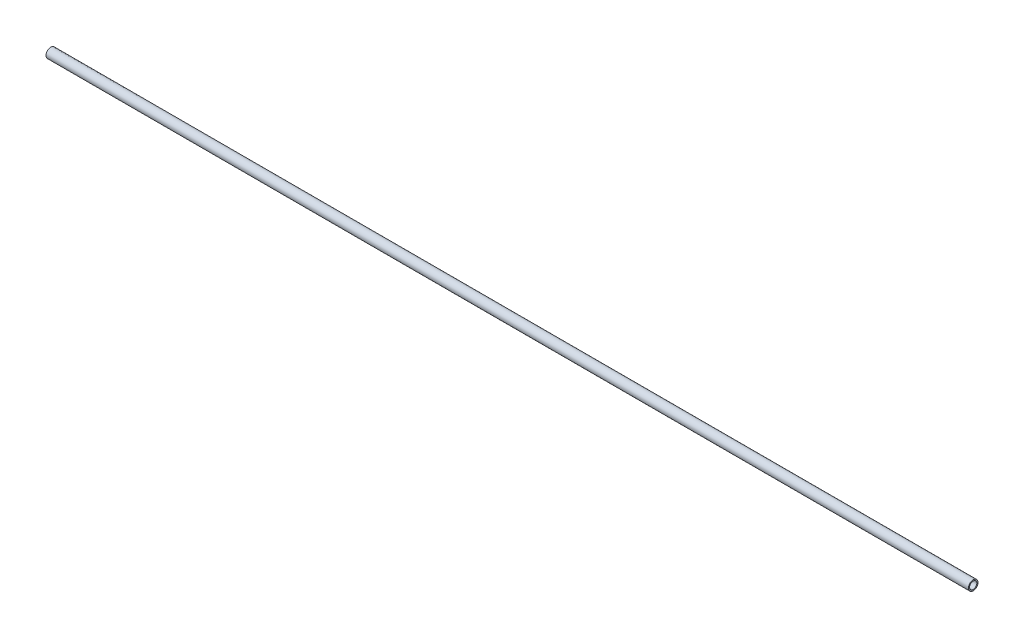
ISO-10303-21;
HEADER;
FILE_DESCRIPTION(('STEP AP214'),'2;1');
FILE_NAME('part.step','',(''),(''),'','','');
FILE_SCHEMA(('AUTOMOTIVE_DESIGN { 1 0 10303 214 1 1 1 1 }'));
ENDSEC;
DATA;
#1=APPLICATION_CONTEXT('core data for automotive mechanical design processes');
#2=APPLICATION_PROTOCOL_DEFINITION('international standard','automotive_design',2000,#1);
#3=PRODUCT_CONTEXT('',#1,'mechanical');
#4=PRODUCT('Part','Part','',(#3));
#5=PRODUCT_RELATED_PRODUCT_CATEGORY('part','',(#4));
#6=PRODUCT_DEFINITION_FORMATION('','',#4);
#7=PRODUCT_DEFINITION_CONTEXT('part definition',#1,'design');
#8=PRODUCT_DEFINITION('design','',#6,#7);
#9=PRODUCT_DEFINITION_SHAPE('','',#8);
#10=(LENGTH_UNIT() NAMED_UNIT(*) SI_UNIT(.MILLI.,.METRE.));
#11=(NAMED_UNIT(*) PLANE_ANGLE_UNIT() SI_UNIT($,.RADIAN.));
#12=(NAMED_UNIT(*) SI_UNIT($,.STERADIAN.) SOLID_ANGLE_UNIT());
#13=UNCERTAINTY_MEASURE_WITH_UNIT(LENGTH_MEASURE(1.E-05),#10,'distance_accuracy_value','');
#14=(GEOMETRIC_REPRESENTATION_CONTEXT(3) GLOBAL_UNCERTAINTY_ASSIGNED_CONTEXT((#13)) GLOBAL_UNIT_ASSIGNED_CONTEXT((#10,
#11,#12)) REPRESENTATION_CONTEXT('',''));
#15=CARTESIAN_POINT('',(0.,0.,0.));
#16=DIRECTION('',(0.,0.,1.));
#17=DIRECTION('',(1.,0.,0.));
#18=AXIS2_PLACEMENT_3D('',#15,#16,#17);
#19=CARTESIAN_POINT('',(1828.8,0.,0.));
#20=DIRECTION('',(1.,0.,0.));
#21=DIRECTION('',(0.,0.,-1.));
#22=AXIS2_PLACEMENT_3D('',#19,#20,#21);
#23=PLANE('',#22);
#24=CARTESIAN_POINT('',(1828.8,0.,0.));
#25=DIRECTION('',(1.,0.,0.));
#26=DIRECTION('',(0.,0.,-1.));
#27=AXIS2_PLACEMENT_3D('',#24,#25,#26);
#28=CIRCLE('',#27,9.525);
#29=CARTESIAN_POINT('',(1828.8,0.,9.525));
#30=VERTEX_POINT('',#29);
#31=EDGE_CURVE('E10',#30,#30,#28,.T.);
#32=ORIENTED_EDGE('',*,*,#31,.T.);
#33=EDGE_LOOP('',(#32));
#34=FACE_BOUND('',#33,.T.);
#35=CARTESIAN_POINT('',(1828.8,0.,0.));
#36=DIRECTION('',(1.,0.,0.));
#37=DIRECTION('',(0.,0.,-1.));
#38=AXIS2_PLACEMENT_3D('',#35,#36,#37);
#39=CIRCLE('',#38,7.112);
#40=CARTESIAN_POINT('',(1828.8,0.,7.112));
#41=VERTEX_POINT('',#40);
#42=EDGE_CURVE('E42',#41,#41,#39,.T.);
#43=ORIENTED_EDGE('',*,*,#42,.F.);
#44=EDGE_LOOP('',(#43));
#45=FACE_BOUND('',#44,.T.);
#46=ADVANCED_FACE('F31',(#34,#45),#23,.T.);
#47=CARTESIAN_POINT('',(0.,0.,0.));
#48=DIRECTION('',(1.,0.,0.));
#49=DIRECTION('',(0.,0.,-1.));
#50=AXIS2_PLACEMENT_3D('',#47,#48,#49);
#51=PLANE('',#50);
#52=CARTESIAN_POINT('',(0.,0.,0.));
#53=DIRECTION('',(1.,0.,0.));
#54=DIRECTION('',(0.,0.,-1.));
#55=AXIS2_PLACEMENT_3D('',#52,#53,#54);
#56=CIRCLE('',#55,9.525);
#57=CARTESIAN_POINT('',(-2.22044604925031E-13,0.,9.525));
#58=VERTEX_POINT('',#57);
#59=EDGE_CURVE('E35',#58,#58,#56,.T.);
#60=ORIENTED_EDGE('',*,*,#59,.F.);
#61=EDGE_LOOP('',(#60));
#62=FACE_BOUND('',#61,.T.);
#63=CARTESIAN_POINT('',(0.,0.,0.));
#64=DIRECTION('',(1.,0.,0.));
#65=DIRECTION('',(0.,0.,-1.));
#66=AXIS2_PLACEMENT_3D('',#63,#64,#65);
#67=CIRCLE('',#66,7.112);
#68=CARTESIAN_POINT('',(-2.22044604925031E-13,0.,7.112));
#69=VERTEX_POINT('',#68);
#70=EDGE_CURVE('E44',#69,#69,#67,.T.);
#71=ORIENTED_EDGE('',*,*,#70,.T.);
#72=EDGE_LOOP('',(#71));
#73=FACE_BOUND('',#72,.T.);
#74=ADVANCED_FACE('F54',(#62,#73),#51,.F.);
#75=CARTESIAN_POINT('',(1828.8,0.,0.));
#76=DIRECTION('',(-1.,0.,0.));
#77=DIRECTION('',(0.,0.,1.));
#78=AXIS2_PLACEMENT_3D('',#75,#76,#77);
#79=CYLINDRICAL_SURFACE('',#78,9.525);
#80=CARTESIAN_POINT('',(1828.8,0.,9.525));
#81=CARTESIAN_POINT('',(1809.75,0.,9.525));
#82=CARTESIAN_POINT('',(1790.7,0.,9.525));
#83=CARTESIAN_POINT('',(1752.6,0.,9.525));
#84=CARTESIAN_POINT('',(1733.55,0.,9.525));
#85=CARTESIAN_POINT('',(1695.45,0.,9.525));
#86=CARTESIAN_POINT('',(1676.4,0.,9.525));
#87=CARTESIAN_POINT('',(1638.3,0.,9.525));
#88=CARTESIAN_POINT('',(1619.25,0.,9.525));
#89=CARTESIAN_POINT('',(1581.15,0.,9.525));
#90=CARTESIAN_POINT('',(1562.1,0.,9.525));
#91=CARTESIAN_POINT('',(1524.,0.,9.525));
#92=CARTESIAN_POINT('',(1504.95,0.,9.525));
#93=CARTESIAN_POINT('',(1466.85,0.,9.525));
#94=CARTESIAN_POINT('',(1447.8,0.,9.525));
#95=CARTESIAN_POINT('',(1409.7,0.,9.525));
#96=CARTESIAN_POINT('',(1390.65,0.,9.525));
#97=CARTESIAN_POINT('',(1352.55,0.,9.525));
#98=CARTESIAN_POINT('',(1333.5,0.,9.525));
#99=CARTESIAN_POINT('',(1295.4,0.,9.525));
#100=CARTESIAN_POINT('',(1276.35,0.,9.525));
#101=CARTESIAN_POINT('',(1238.25,0.,9.525));
#102=CARTESIAN_POINT('',(1219.2,0.,9.525));
#103=CARTESIAN_POINT('',(1181.1,0.,9.525));
#104=CARTESIAN_POINT('',(1162.05,0.,9.525));
#105=CARTESIAN_POINT('',(1123.95,0.,9.525));
#106=CARTESIAN_POINT('',(1104.9,0.,9.525));
#107=CARTESIAN_POINT('',(1066.8,0.,9.525));
#108=CARTESIAN_POINT('',(1047.75,0.,9.525));
#109=CARTESIAN_POINT('',(1009.65,0.,9.525));
#110=CARTESIAN_POINT('',(990.6,0.,9.525));
#111=CARTESIAN_POINT('',(952.5,0.,9.525));
#112=CARTESIAN_POINT('',(933.45,0.,9.525));
#113=CARTESIAN_POINT('',(895.35,0.,9.525));
#114=CARTESIAN_POINT('',(876.3,0.,9.525));
#115=CARTESIAN_POINT('',(838.2,0.,9.525));
#116=CARTESIAN_POINT('',(819.15,0.,9.525));
#117=CARTESIAN_POINT('',(781.05,0.,9.525));
#118=CARTESIAN_POINT('',(762.,0.,9.525));
#119=CARTESIAN_POINT('',(723.9,0.,9.525));
#120=CARTESIAN_POINT('',(704.85,0.,9.525));
#121=CARTESIAN_POINT('',(666.75,0.,9.525));
#122=CARTESIAN_POINT('',(647.7,0.,9.525));
#123=CARTESIAN_POINT('',(609.6,0.,9.525));
#124=CARTESIAN_POINT('',(590.55,0.,9.525));
#125=CARTESIAN_POINT('',(552.45,0.,9.525));
#126=CARTESIAN_POINT('',(533.4,0.,9.525));
#127=CARTESIAN_POINT('',(495.3,0.,9.525));
#128=CARTESIAN_POINT('',(476.25,0.,9.525));
#129=CARTESIAN_POINT('',(438.15,0.,9.525));
#130=CARTESIAN_POINT('',(419.1,0.,9.525));
#131=CARTESIAN_POINT('',(381.,0.,9.525));
#132=CARTESIAN_POINT('',(361.95,0.,9.525));
#133=CARTESIAN_POINT('',(323.85,0.,9.525));
#134=CARTESIAN_POINT('',(304.8,0.,9.525));
#135=CARTESIAN_POINT('',(266.7,0.,9.525));
#136=CARTESIAN_POINT('',(247.65,0.,9.525));
#137=CARTESIAN_POINT('',(209.55,0.,9.525));
#138=CARTESIAN_POINT('',(190.5,0.,9.525));
#139=CARTESIAN_POINT('',(152.4,0.,9.525));
#140=CARTESIAN_POINT('',(133.35,0.,9.525));
#141=CARTESIAN_POINT('',(95.2499999999998,0.,9.525));
#142=CARTESIAN_POINT('',(76.1999999999998,0.,9.525));
#143=CARTESIAN_POINT('',(38.0999999999998,0.,9.525));
#144=CARTESIAN_POINT('',(19.0499999999998,0.,9.525));
#145=CARTESIAN_POINT('',(-2.22044604925031E-13,0.,9.525));
#146=B_SPLINE_CURVE_WITH_KNOTS('',3,(#80,#81,#82,#83,#84,#85,#86,#87,#88,#89,#90,#91,#92,#93,
#94,#95,#96,#97,#98,#99,#100,#101,#102,#103,#104,#105,#106,#107,#108,#109,#110,#111,#112,#113,
#114,#115,#116,#117,#118,#119,#120,#121,#122,#123,#124,#125,#126,#127,#128,#129,#130,#131,#132,
#133,#134,#135,#136,#137,#138,#139,#140,#141,#142,#143,#144,#145),.UNSPECIFIED.,.F.,.F.,(4,2,2,
2,2,2,2,2,2,2,2,2,2,2,2,2,2,2,2,2,2,2,2,2,2,2,2,2,2,2,2,2,4),(0.,57.15,114.3,171.45,228.6,
285.75,342.9,400.05,457.2,514.35,571.5,628.65,685.8,742.95,800.1,857.25,914.4,971.55,1028.7,
1085.85,1143.,1200.15,1257.3,1314.45,1371.6,1428.75,1485.9,1543.05,1600.2,1657.35,1714.5,
1771.65,1828.8),.UNSPECIFIED.);
#147=EDGE_CURVE('BSEAM33',#30,#58,#146,.T.);
#148=ORIENTED_EDGE('',*,*,#31,.F.);
#149=ORIENTED_EDGE('',*,*,#59,.T.);
#150=ORIENTED_EDGE('',*,*,#147,.T.);
#151=ORIENTED_EDGE('',*,*,#147,.F.);
#152=EDGE_LOOP('',(#148,#150,#149,#151));
#153=FACE_BOUND('',#152,.T.);
#154=ADVANCED_FACE('F33',(#153),#79,.T.);
#155=CARTESIAN_POINT('',(1828.8,0.,0.));
#156=DIRECTION('',(-1.,0.,0.));
#157=DIRECTION('',(0.,0.,1.));
#158=AXIS2_PLACEMENT_3D('',#155,#156,#157);
#159=CYLINDRICAL_SURFACE('',#158,7.112);
#160=CARTESIAN_POINT('',(1828.8,0.,7.112));
#161=CARTESIAN_POINT('',(1809.75,0.,7.112));
#162=CARTESIAN_POINT('',(1790.7,0.,7.112));
#163=CARTESIAN_POINT('',(1752.6,0.,7.112));
#164=CARTESIAN_POINT('',(1733.55,0.,7.112));
#165=CARTESIAN_POINT('',(1695.45,0.,7.112));
#166=CARTESIAN_POINT('',(1676.4,0.,7.112));
#167=CARTESIAN_POINT('',(1638.3,0.,7.112));
#168=CARTESIAN_POINT('',(1619.25,0.,7.112));
#169=CARTESIAN_POINT('',(1581.15,0.,7.112));
#170=CARTESIAN_POINT('',(1562.1,0.,7.112));
#171=CARTESIAN_POINT('',(1524.,0.,7.112));
#172=CARTESIAN_POINT('',(1504.95,0.,7.112));
#173=CARTESIAN_POINT('',(1466.85,0.,7.112));
#174=CARTESIAN_POINT('',(1447.8,0.,7.112));
#175=CARTESIAN_POINT('',(1409.7,0.,7.112));
#176=CARTESIAN_POINT('',(1390.65,0.,7.112));
#177=CARTESIAN_POINT('',(1352.55,0.,7.112));
#178=CARTESIAN_POINT('',(1333.5,0.,7.112));
#179=CARTESIAN_POINT('',(1295.4,0.,7.112));
#180=CARTESIAN_POINT('',(1276.35,0.,7.112));
#181=CARTESIAN_POINT('',(1238.25,0.,7.112));
#182=CARTESIAN_POINT('',(1219.2,0.,7.112));
#183=CARTESIAN_POINT('',(1181.1,0.,7.112));
#184=CARTESIAN_POINT('',(1162.05,0.,7.112));
#185=CARTESIAN_POINT('',(1123.95,0.,7.112));
#186=CARTESIAN_POINT('',(1104.9,0.,7.112));
#187=CARTESIAN_POINT('',(1066.8,0.,7.112));
#188=CARTESIAN_POINT('',(1047.75,0.,7.112));
#189=CARTESIAN_POINT('',(1009.65,0.,7.112));
#190=CARTESIAN_POINT('',(990.6,0.,7.112));
#191=CARTESIAN_POINT('',(952.5,0.,7.112));
#192=CARTESIAN_POINT('',(933.45,0.,7.112));
#193=CARTESIAN_POINT('',(895.35,0.,7.112));
#194=CARTESIAN_POINT('',(876.3,0.,7.112));
#195=CARTESIAN_POINT('',(838.2,0.,7.112));
#196=CARTESIAN_POINT('',(819.15,0.,7.112));
#197=CARTESIAN_POINT('',(781.05,0.,7.112));
#198=CARTESIAN_POINT('',(762.,0.,7.112));
#199=CARTESIAN_POINT('',(723.9,0.,7.112));
#200=CARTESIAN_POINT('',(704.85,0.,7.112));
#201=CARTESIAN_POINT('',(666.75,0.,7.112));
#202=CARTESIAN_POINT('',(647.7,0.,7.112));
#203=CARTESIAN_POINT('',(609.6,0.,7.112));
#204=CARTESIAN_POINT('',(590.55,0.,7.112));
#205=CARTESIAN_POINT('',(552.45,0.,7.112));
#206=CARTESIAN_POINT('',(533.4,0.,7.112));
#207=CARTESIAN_POINT('',(495.3,0.,7.112));
#208=CARTESIAN_POINT('',(476.25,0.,7.112));
#209=CARTESIAN_POINT('',(438.15,0.,7.112));
#210=CARTESIAN_POINT('',(419.1,0.,7.112));
#211=CARTESIAN_POINT('',(381.,0.,7.112));
#212=CARTESIAN_POINT('',(361.95,0.,7.112));
#213=CARTESIAN_POINT('',(323.85,0.,7.112));
#214=CARTESIAN_POINT('',(304.8,0.,7.112));
#215=CARTESIAN_POINT('',(266.7,0.,7.112));
#216=CARTESIAN_POINT('',(247.65,0.,7.112));
#217=CARTESIAN_POINT('',(209.55,0.,7.112));
#218=CARTESIAN_POINT('',(190.5,0.,7.112));
#219=CARTESIAN_POINT('',(152.4,0.,7.112));
#220=CARTESIAN_POINT('',(133.35,0.,7.112));
#221=CARTESIAN_POINT('',(95.2499999999998,0.,7.112));
#222=CARTESIAN_POINT('',(76.1999999999998,0.,7.112));
#223=CARTESIAN_POINT('',(38.0999999999998,0.,7.112));
#224=CARTESIAN_POINT('',(19.0499999999998,0.,7.112));
#225=CARTESIAN_POINT('',(-2.22044604925031E-13,0.,7.112));
#226=B_SPLINE_CURVE_WITH_KNOTS('',3,(#160,#161,#162,#163,#164,#165,#166,#167,#168,#169,#170,
#171,#172,#173,#174,#175,#176,#177,#178,#179,#180,#181,#182,#183,#184,#185,#186,#187,#188,#189,
#190,#191,#192,#193,#194,#195,#196,#197,#198,#199,#200,#201,#202,#203,#204,#205,#206,#207,#208,
#209,#210,#211,#212,#213,#214,#215,#216,#217,#218,#219,#220,#221,#222,#223,#224,#225),
.UNSPECIFIED.,.F.,.F.,(4,2,2,2,2,2,2,2,2,2,2,2,2,2,2,2,2,2,2,2,2,2,2,2,2,2,2,2,2,2,2,2,4),(0.,
57.1499999999998,114.3,171.45,228.6,285.75,342.9,400.05,457.2,514.35,571.5,628.65,685.8,742.95,
800.1,857.25,914.4,971.55,1028.7,1085.85,1143.,1200.15,1257.3,1314.45,1371.6,1428.75,1485.9,
1543.05,1600.2,1657.35,1714.5,1771.65,1828.8),.UNSPECIFIED.);
#227=EDGE_CURVE('BSEAM50',#41,#69,#226,.T.);
#228=ORIENTED_EDGE('',*,*,#42,.T.);
#229=ORIENTED_EDGE('',*,*,#70,.F.);
#230=ORIENTED_EDGE('',*,*,#227,.T.);
#231=ORIENTED_EDGE('',*,*,#227,.F.);
#232=EDGE_LOOP('',(#228,#230,#229,#231));
#233=FACE_BOUND('',#232,.T.);
#234=ADVANCED_FACE('F50',(#233),#159,.F.);
#235=CLOSED_SHELL('',(#46,#74,#154,#234));
#236=MANIFOLD_SOLID_BREP('B2',#235);
#237=ADVANCED_BREP_SHAPE_REPRESENTATION('',(#18,#236),#14);
#238=SHAPE_DEFINITION_REPRESENTATION(#9,#237);
ENDSEC;
END-ISO-10303-21;
